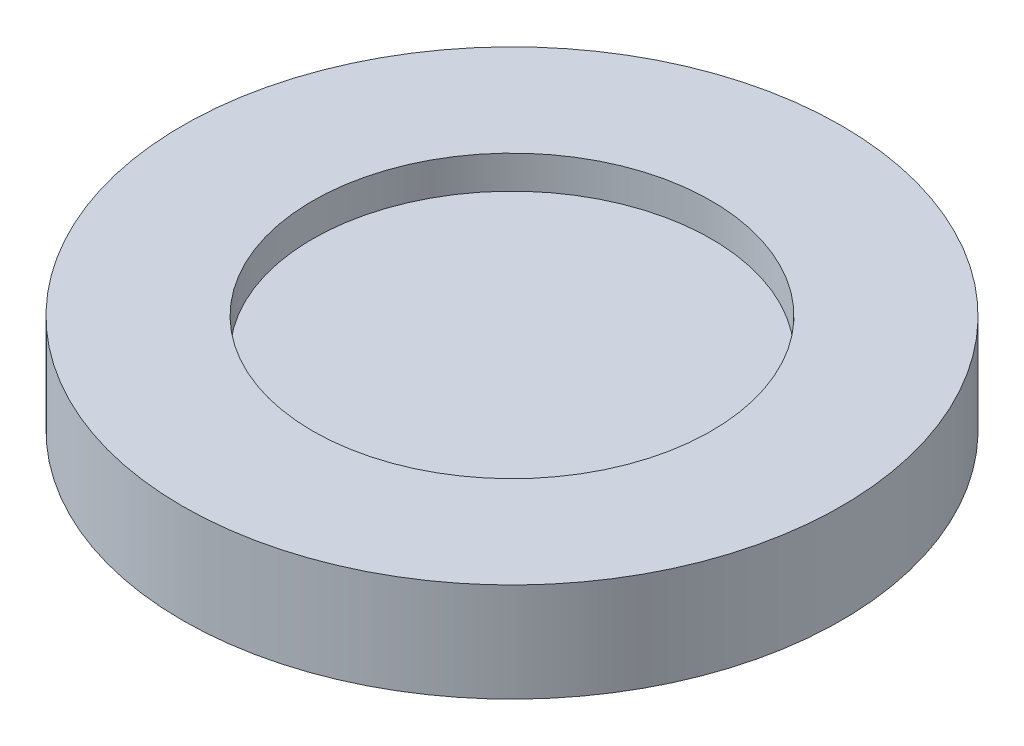
ISO-10303-21;
HEADER;
FILE_DESCRIPTION(('STEP AP214'),'2;1');
FILE_NAME('part.step','',(''),(''),'','','');
FILE_SCHEMA(('AUTOMOTIVE_DESIGN { 1 0 10303 214 1 1 1 1 }'));
ENDSEC;
DATA;
#1=APPLICATION_CONTEXT('core data for automotive mechanical design processes');
#2=APPLICATION_PROTOCOL_DEFINITION('international standard','automotive_design',2000,#1);
#3=PRODUCT_CONTEXT('',#1,'mechanical');
#4=PRODUCT('Part','Part','',(#3));
#5=PRODUCT_RELATED_PRODUCT_CATEGORY('part','',(#4));
#6=PRODUCT_DEFINITION_FORMATION('','',#4);
#7=PRODUCT_DEFINITION_CONTEXT('part definition',#1,'design');
#8=PRODUCT_DEFINITION('design','',#6,#7);
#9=PRODUCT_DEFINITION_SHAPE('','',#8);
#10=(LENGTH_UNIT() NAMED_UNIT(*) SI_UNIT(.MILLI.,.METRE.));
#11=(NAMED_UNIT(*) PLANE_ANGLE_UNIT() SI_UNIT($,.RADIAN.));
#12=(NAMED_UNIT(*) SI_UNIT($,.STERADIAN.) SOLID_ANGLE_UNIT());
#13=UNCERTAINTY_MEASURE_WITH_UNIT(LENGTH_MEASURE(1.E-05),#10,'distance_accuracy_value','');
#14=(GEOMETRIC_REPRESENTATION_CONTEXT(3) GLOBAL_UNCERTAINTY_ASSIGNED_CONTEXT((#13)) GLOBAL_UNIT_ASSIGNED_CONTEXT((#10,
#11,#12)) REPRESENTATION_CONTEXT('',''));
#15=CARTESIAN_POINT('',(0.,0.,0.));
#16=DIRECTION('',(0.,0.,1.));
#17=DIRECTION('',(1.,0.,0.));
#18=AXIS2_PLACEMENT_3D('',#15,#16,#17);
#19=CARTESIAN_POINT('',(0.,3.,0.));
#20=DIRECTION('',(0.,-1.,0.));
#21=DIRECTION('',(0.,0.,-1.));
#22=AXIS2_PLACEMENT_3D('',#19,#20,#21);
#23=CYLINDRICAL_SURFACE('',#22,10.);
#24=CARTESIAN_POINT('',(0.,3.,0.));
#25=DIRECTION('',(0.,1.,0.));
#26=DIRECTION('',(0.,0.,1.));
#27=AXIS2_PLACEMENT_3D('',#24,#25,#26);
#28=CIRCLE('',#27,10.);
#29=CARTESIAN_POINT('',(0.,3.,10.));
#30=VERTEX_POINT('',#29);
#31=EDGE_CURVE('E10',#30,#30,#28,.T.);
#32=ORIENTED_EDGE('',*,*,#31,.F.);
#33=EDGE_LOOP('',(#32));
#34=FACE_BOUND('',#33,.T.);
#35=CARTESIAN_POINT('',(0.,0.,0.));
#36=DIRECTION('',(0.,1.,0.));
#37=DIRECTION('',(0.,0.,1.));
#38=AXIS2_PLACEMENT_3D('',#35,#36,#37);
#39=CIRCLE('',#38,10.);
#40=CARTESIAN_POINT('',(0.,0.,10.));
#41=VERTEX_POINT('',#40);
#42=EDGE_CURVE('E40',#41,#41,#39,.T.);
#43=ORIENTED_EDGE('',*,*,#42,.T.);
#44=EDGE_LOOP('',(#43));
#45=FACE_BOUND('',#44,.T.);
#46=ADVANCED_FACE('F37',(#34,#45),#23,.T.);
#47=CARTESIAN_POINT('',(0.,3.,0.));
#48=DIRECTION('',(0.,1.,0.));
#49=DIRECTION('',(0.,0.,1.));
#50=AXIS2_PLACEMENT_3D('',#47,#48,#49);
#51=PLANE('',#50);
#52=CARTESIAN_POINT('',(0.,3.,0.));
#53=DIRECTION('',(0.,1.,0.));
#54=DIRECTION('',(0.,0.,1.));
#55=AXIS2_PLACEMENT_3D('',#52,#53,#54);
#56=CIRCLE('',#55,6.05);
#57=CARTESIAN_POINT('',(0.,3.,6.05));
#58=VERTEX_POINT('',#57);
#59=EDGE_CURVE('E49',#58,#58,#56,.T.);
#60=ORIENTED_EDGE('',*,*,#59,.F.);
#61=EDGE_LOOP('',(#60));
#62=FACE_BOUND('',#61,.T.);
#63=ORIENTED_EDGE('',*,*,#31,.T.);
#64=EDGE_LOOP('',(#63));
#65=FACE_BOUND('',#64,.T.);
#66=ADVANCED_FACE('F64',(#62,#65),#51,.T.);
#67=CARTESIAN_POINT('',(0.,0.,0.));
#68=DIRECTION('',(0.,1.,0.));
#69=DIRECTION('',(0.,0.,1.));
#70=AXIS2_PLACEMENT_3D('',#67,#68,#69);
#71=PLANE('',#70);
#72=ORIENTED_EDGE('',*,*,#42,.F.);
#73=EDGE_LOOP('',(#72));
#74=FACE_BOUND('',#73,.T.);
#75=ADVANCED_FACE('F60',(#74),#71,.F.);
#76=CARTESIAN_POINT('',(0.,2.,0.));
#77=DIRECTION('',(0.,1.,0.));
#78=DIRECTION('',(0.,0.,1.));
#79=AXIS2_PLACEMENT_3D('',#76,#77,#78);
#80=CYLINDRICAL_SURFACE('',#79,6.05);
#81=CARTESIAN_POINT('',(0.,2.,0.));
#82=DIRECTION('',(0.,1.,0.));
#83=DIRECTION('',(0.,0.,1.));
#84=AXIS2_PLACEMENT_3D('',#81,#82,#83);
#85=CIRCLE('',#84,6.05);
#86=CARTESIAN_POINT('',(0.,2.,6.05));
#87=VERTEX_POINT('',#86);
#88=EDGE_CURVE('E47',#87,#87,#85,.T.);
#89=ORIENTED_EDGE('',*,*,#88,.F.);
#90=EDGE_LOOP('',(#89));
#91=FACE_BOUND('',#90,.T.);
#92=ORIENTED_EDGE('',*,*,#59,.T.);
#93=EDGE_LOOP('',(#92));
#94=FACE_BOUND('',#93,.T.);
#95=ADVANCED_FACE('F57',(#91,#94),#80,.F.);
#96=CARTESIAN_POINT('',(0.,2.,0.));
#97=DIRECTION('',(0.,1.,0.));
#98=DIRECTION('',(0.,0.,1.));
#99=AXIS2_PLACEMENT_3D('',#96,#97,#98);
#100=PLANE('',#99);
#101=ORIENTED_EDGE('',*,*,#88,.T.);
#102=EDGE_LOOP('',(#101));
#103=FACE_BOUND('',#102,.T.);
#104=ADVANCED_FACE('F55',(#103),#100,.T.);
#105=CLOSED_SHELL('',(#46,#66,#75,#95,#104));
#106=MANIFOLD_SOLID_BREP('B2',#105);
#107=ADVANCED_BREP_SHAPE_REPRESENTATION('',(#18,#106),#14);
#108=SHAPE_DEFINITION_REPRESENTATION(#9,#107);
ENDSEC;
END-ISO-10303-21;
